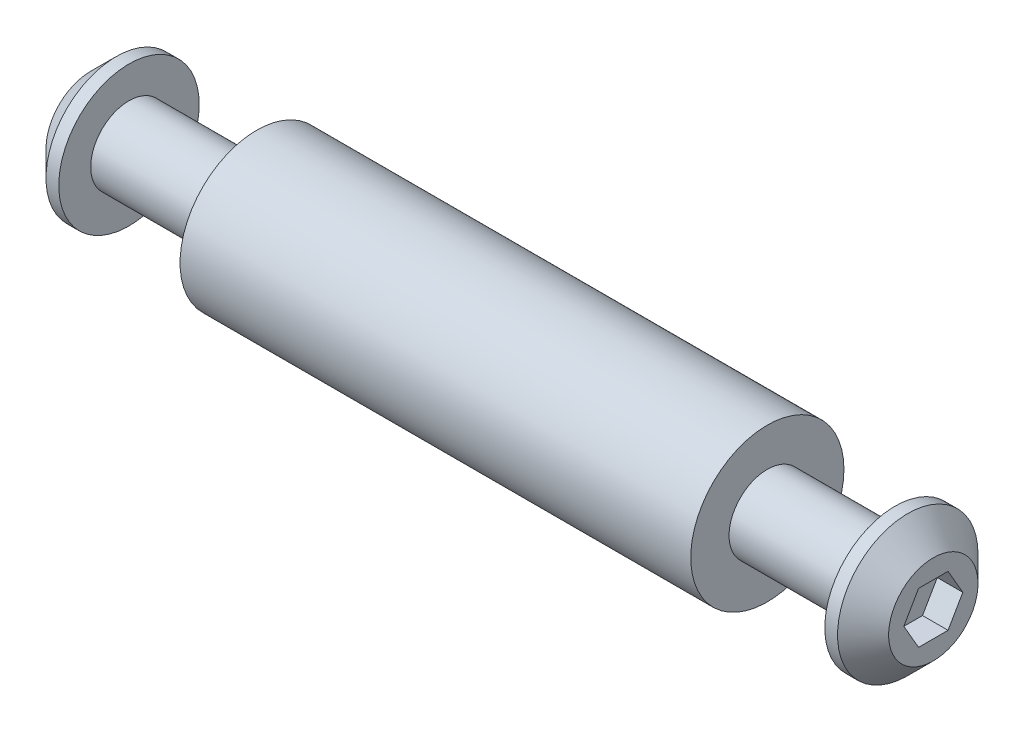
ISO-10303-21;
HEADER;
FILE_DESCRIPTION(('STEP AP214'),'2;1');
FILE_NAME('part.step','',(''),(''),'','','');
FILE_SCHEMA(('AUTOMOTIVE_DESIGN { 1 0 10303 214 1 1 1 1 }'));
ENDSEC;
DATA;
#1=APPLICATION_CONTEXT('core data for automotive mechanical design processes');
#2=APPLICATION_PROTOCOL_DEFINITION('international standard','automotive_design',2000,#1);
#3=PRODUCT_CONTEXT('',#1,'mechanical');
#4=PRODUCT('Part','Part','',(#3));
#5=PRODUCT_RELATED_PRODUCT_CATEGORY('part','',(#4));
#6=PRODUCT_DEFINITION_FORMATION('','',#4);
#7=PRODUCT_DEFINITION_CONTEXT('part definition',#1,'design');
#8=PRODUCT_DEFINITION('design','',#6,#7);
#9=PRODUCT_DEFINITION_SHAPE('','',#8);
#10=(LENGTH_UNIT() NAMED_UNIT(*) SI_UNIT(.MILLI.,.METRE.));
#11=(NAMED_UNIT(*) PLANE_ANGLE_UNIT() SI_UNIT($,.RADIAN.));
#12=(NAMED_UNIT(*) SI_UNIT($,.STERADIAN.) SOLID_ANGLE_UNIT());
#13=UNCERTAINTY_MEASURE_WITH_UNIT(LENGTH_MEASURE(1.E-05),#10,'distance_accuracy_value','');
#14=(GEOMETRIC_REPRESENTATION_CONTEXT(3) GLOBAL_UNCERTAINTY_ASSIGNED_CONTEXT((#13)) GLOBAL_UNIT_ASSIGNED_CONTEXT((#10,
#11,#12)) REPRESENTATION_CONTEXT('',''));
#15=CARTESIAN_POINT('',(0.,0.,0.));
#16=DIRECTION('',(0.,0.,1.));
#17=DIRECTION('',(1.,0.,0.));
#18=AXIS2_PLACEMENT_3D('',#15,#16,#17);
#19=CARTESIAN_POINT('',(-16.5,1.75,0.));
#20=DIRECTION('',(-1.,0.,0.));
#21=DIRECTION('',(0.,0.,1.));
#22=AXIS2_PLACEMENT_3D('',#19,#20,#21);
#23=PLANE('',#22);
#24=CARTESIAN_POINT('',(-16.5,0.,0.));
#25=DIRECTION('',(1.,0.,0.));
#26=DIRECTION('',(0.,0.,-1.));
#27=AXIS2_PLACEMENT_3D('',#24,#25,#26);
#28=CIRCLE('',#27,1.75);
#29=CARTESIAN_POINT('',(-16.5,0.,-1.75));
#30=VERTEX_POINT('',#29);
#31=EDGE_CURVE('E245',#30,#30,#28,.T.);
#32=ORIENTED_EDGE('',*,*,#31,.F.);
#33=EDGE_LOOP('',(#32));
#34=FACE_BOUND('',#33,.T.);
#35=DIRECTION('',(0.,0.866025403784439,-0.5));
#36=VECTOR('',#35,1.);
#37=CARTESIAN_POINT('',(-16.5,-1.,-0.577350269189626));
#38=LINE('',#37,#36);
#39=CARTESIAN_POINT('',(-16.5,-1.,-0.577350269189626));
#40=VERTEX_POINT('',#39);
#41=CARTESIAN_POINT('',(-16.5,0.,-1.15470053837925));
#42=VERTEX_POINT('',#41);
#43=EDGE_CURVE('E156',#40,#42,#38,.T.);
#44=ORIENTED_EDGE('',*,*,#43,.T.);
#45=DIRECTION('',(0.,0.866025403784439,0.5));
#46=VECTOR('',#45,1.);
#47=CARTESIAN_POINT('',(-16.5,0.,-1.15470053837925));
#48=LINE('',#47,#46);
#49=CARTESIAN_POINT('',(-16.5,1.,-0.577350269189626));
#50=VERTEX_POINT('',#49);
#51=EDGE_CURVE('E48',#42,#50,#48,.T.);
#52=ORIENTED_EDGE('',*,*,#51,.T.);
#53=DIRECTION('',(0.,0.,1.));
#54=VECTOR('',#53,1.);
#55=CARTESIAN_POINT('',(-16.5,1.,-0.577350269189626));
#56=LINE('',#55,#54);
#57=CARTESIAN_POINT('',(-16.5,1.,0.577350269189626));
#58=VERTEX_POINT('',#57);
#59=EDGE_CURVE('E143',#50,#58,#56,.T.);
#60=ORIENTED_EDGE('',*,*,#59,.T.);
#61=DIRECTION('',(0.,-0.866025403784438,0.5));
#62=VECTOR('',#61,1.);
#63=CARTESIAN_POINT('',(-16.5,1.,0.577350269189626));
#64=LINE('',#63,#62);
#65=CARTESIAN_POINT('',(-16.5,0.,1.15470053837925));
#66=VERTEX_POINT('',#65);
#67=EDGE_CURVE('E146',#58,#66,#64,.T.);
#68=ORIENTED_EDGE('',*,*,#67,.T.);
#69=DIRECTION('',(0.,-0.866025403784439,-0.5));
#70=VECTOR('',#69,1.);
#71=CARTESIAN_POINT('',(-16.5,0.,1.15470053837925));
#72=LINE('',#71,#70);
#73=CARTESIAN_POINT('',(-16.5,-1.,0.577350269189627));
#74=VERTEX_POINT('',#73);
#75=EDGE_CURVE('E161',#66,#74,#72,.T.);
#76=ORIENTED_EDGE('',*,*,#75,.T.);
#77=DIRECTION('',(0.,0.,-1.));
#78=VECTOR('',#77,1.);
#79=CARTESIAN_POINT('',(-16.5,-1.,0.577350269189627));
#80=LINE('',#79,#78);
#81=EDGE_CURVE('E158',#74,#40,#80,.T.);
#82=ORIENTED_EDGE('',*,*,#81,.T.);
#83=EDGE_LOOP('',(#44,#52,#60,#68,#76,#82));
#84=FACE_BOUND('',#83,.T.);
#85=ADVANCED_FACE('F33',(#34,#84),#23,.T.);
#86=CARTESIAN_POINT('',(15.,1.5,0.));
#87=DIRECTION('',(-1.,0.,0.));
#88=DIRECTION('',(0.,0.,1.));
#89=AXIS2_PLACEMENT_3D('',#86,#87,#88);
#90=PLANE('',#89);
#91=CARTESIAN_POINT('',(15.,0.,0.));
#92=DIRECTION('',(1.,0.,0.));
#93=DIRECTION('',(0.,0.,-1.));
#94=AXIS2_PLACEMENT_3D('',#91,#92,#93);
#95=CIRCLE('',#94,1.5);
#96=CARTESIAN_POINT('',(15.,0.,-1.5));
#97=VERTEX_POINT('',#96);
#98=EDGE_CURVE('E212',#97,#97,#95,.T.);
#99=ORIENTED_EDGE('',*,*,#98,.T.);
#100=EDGE_LOOP('',(#99));
#101=FACE_BOUND('',#100,.T.);
#102=CARTESIAN_POINT('',(15.,0.,0.));
#103=DIRECTION('',(1.,0.,0.));
#104=DIRECTION('',(0.,0.,-1.));
#105=AXIS2_PLACEMENT_3D('',#102,#103,#104);
#106=CIRCLE('',#105,2.75000000000004);
#107=CARTESIAN_POINT('',(15.,0.,-2.75000000000004));
#108=VERTEX_POINT('',#107);
#109=EDGE_CURVE('E11',#108,#108,#106,.T.);
#110=ORIENTED_EDGE('',*,*,#109,.F.);
#111=EDGE_LOOP('',(#110));
#112=FACE_BOUND('',#111,.T.);
#113=ADVANCED_FACE('F35',(#101,#112),#90,.T.);
#114=CARTESIAN_POINT('',(0.,0.,0.));
#115=DIRECTION('',(1.,0.,0.));
#116=DIRECTION('',(0.,0.,-1.));
#117=AXIS2_PLACEMENT_3D('',#114,#115,#116);
#118=CYLINDRICAL_SURFACE('',#117,2.75000000000002);
#119=ORIENTED_EDGE('',*,*,#109,.T.);
#120=EDGE_LOOP('',(#119));
#121=FACE_BOUND('',#120,.T.);
#122=CARTESIAN_POINT('',(15.5,0.,0.));
#123=DIRECTION('',(1.,0.,0.));
#124=DIRECTION('',(0.,0.,-1.));
#125=AXIS2_PLACEMENT_3D('',#122,#123,#124);
#126=CIRCLE('',#125,2.75);
#127=CARTESIAN_POINT('',(15.5,0.,-2.75));
#128=VERTEX_POINT('',#127);
#129=EDGE_CURVE('E41',#128,#128,#126,.T.);
#130=ORIENTED_EDGE('',*,*,#129,.F.);
#131=EDGE_LOOP('',(#130));
#132=FACE_BOUND('',#131,.T.);
#133=ADVANCED_FACE('F256',(#121,#132),#118,.T.);
#134=CARTESIAN_POINT('',(16.5,0.,0.));
#135=DIRECTION('',(-1.,0.,0.));
#136=DIRECTION('',(0.,0.,1.));
#137=AXIS2_PLACEMENT_3D('',#134,#135,#136);
#138=CONICAL_SURFACE('',#137,1.75,0.78539816339745);
#139=ORIENTED_EDGE('',*,*,#129,.T.);
#140=EDGE_LOOP('',(#139));
#141=FACE_BOUND('',#140,.T.);
#142=CARTESIAN_POINT('',(16.5,0.,0.));
#143=DIRECTION('',(1.,0.,0.));
#144=DIRECTION('',(0.,0.,-1.));
#145=AXIS2_PLACEMENT_3D('',#142,#143,#144);
#146=CIRCLE('',#145,1.75);
#147=CARTESIAN_POINT('',(16.5,0.,-1.75));
#148=VERTEX_POINT('',#147);
#149=EDGE_CURVE('E248',#148,#148,#146,.T.);
#150=ORIENTED_EDGE('',*,*,#149,.F.);
#151=EDGE_LOOP('',(#150));
#152=FACE_BOUND('',#151,.T.);
#153=ADVANCED_FACE('F253',(#141,#152),#138,.T.);
#154=CARTESIAN_POINT('',(16.5,1.75,0.));
#155=DIRECTION('',(1.,0.,0.));
#156=DIRECTION('',(0.,0.,-1.));
#157=AXIS2_PLACEMENT_3D('',#154,#155,#156);
#158=PLANE('',#157);
#159=DIRECTION('',(0.,0.866025403784439,0.5));
#160=VECTOR('',#159,1.);
#161=CARTESIAN_POINT('',(16.5,0.,-1.15470053837925));
#162=LINE('',#161,#160);
#163=CARTESIAN_POINT('',(16.5,0.,-1.15470053837925));
#164=VERTEX_POINT('',#163);
#165=CARTESIAN_POINT('',(16.5,1.,-0.577350269189626));
#166=VERTEX_POINT('',#165);
#167=EDGE_CURVE('E56',#164,#166,#162,.T.);
#168=ORIENTED_EDGE('',*,*,#167,.F.);
#169=DIRECTION('',(0.,0.866025403784439,-0.5));
#170=VECTOR('',#169,1.);
#171=CARTESIAN_POINT('',(16.5,-1.,-0.577350269189626));
#172=LINE('',#171,#170);
#173=CARTESIAN_POINT('',(16.5,-1.,-0.577350269189626));
#174=VERTEX_POINT('',#173);
#175=EDGE_CURVE('E179',#174,#164,#172,.T.);
#176=ORIENTED_EDGE('',*,*,#175,.F.);
#177=DIRECTION('',(0.,0.,-1.));
#178=VECTOR('',#177,1.);
#179=CARTESIAN_POINT('',(16.5,-1.,0.577350269189627));
#180=LINE('',#179,#178);
#181=CARTESIAN_POINT('',(16.5,-1.,0.577350269189627));
#182=VERTEX_POINT('',#181);
#183=EDGE_CURVE('E205',#182,#174,#180,.T.);
#184=ORIENTED_EDGE('',*,*,#183,.F.);
#185=DIRECTION('',(0.,-0.866025403784439,-0.5));
#186=VECTOR('',#185,1.);
#187=CARTESIAN_POINT('',(16.5,0.,1.15470053837925));
#188=LINE('',#187,#186);
#189=CARTESIAN_POINT('',(16.5,0.,1.15470053837925));
#190=VERTEX_POINT('',#189);
#191=EDGE_CURVE('E202',#190,#182,#188,.T.);
#192=ORIENTED_EDGE('',*,*,#191,.F.);
#193=DIRECTION('',(0.,-0.866025403784438,0.5));
#194=VECTOR('',#193,1.);
#195=CARTESIAN_POINT('',(16.5,1.,0.577350269189626));
#196=LINE('',#195,#194);
#197=CARTESIAN_POINT('',(16.5,1.,0.577350269189626));
#198=VERTEX_POINT('',#197);
#199=EDGE_CURVE('E199',#198,#190,#196,.T.);
#200=ORIENTED_EDGE('',*,*,#199,.F.);
#201=DIRECTION('',(0.,0.,1.));
#202=VECTOR('',#201,1.);
#203=CARTESIAN_POINT('',(16.5,1.,-0.577350269189626));
#204=LINE('',#203,#202);
#205=EDGE_CURVE('E196',#166,#198,#204,.T.);
#206=ORIENTED_EDGE('',*,*,#205,.F.);
#207=EDGE_LOOP('',(#168,#176,#184,#192,#200,#206));
#208=FACE_BOUND('',#207,.T.);
#209=ORIENTED_EDGE('',*,*,#149,.T.);
#210=EDGE_LOOP('',(#209));
#211=FACE_BOUND('',#210,.T.);
#212=ADVANCED_FACE('F263',(#208,#211),#158,.T.);
#213=CARTESIAN_POINT('',(-15.5,0.,0.));
#214=DIRECTION('',(1.,0.,0.));
#215=DIRECTION('',(0.,0.,-1.));
#216=AXIS2_PLACEMENT_3D('',#213,#214,#215);
#217=CONICAL_SURFACE('',#216,2.75,0.78539816339745);
#218=ORIENTED_EDGE('',*,*,#31,.T.);
#219=EDGE_LOOP('',(#218));
#220=FACE_BOUND('',#219,.T.);
#221=CARTESIAN_POINT('',(-15.5,0.,0.));
#222=DIRECTION('',(1.,0.,0.));
#223=DIRECTION('',(0.,0.,-1.));
#224=AXIS2_PLACEMENT_3D('',#221,#222,#223);
#225=CIRCLE('',#224,2.75);
#226=CARTESIAN_POINT('',(-15.5,0.,-2.75));
#227=VERTEX_POINT('',#226);
#228=EDGE_CURVE('E242',#227,#227,#225,.T.);
#229=ORIENTED_EDGE('',*,*,#228,.F.);
#230=EDGE_LOOP('',(#229));
#231=FACE_BOUND('',#230,.T.);
#232=ADVANCED_FACE('F275',(#220,#231),#217,.T.);
#233=CARTESIAN_POINT('',(0.,0.,0.));
#234=DIRECTION('',(1.,0.,0.));
#235=DIRECTION('',(0.,0.,-1.));
#236=AXIS2_PLACEMENT_3D('',#233,#234,#235);
#237=CYLINDRICAL_SURFACE('',#236,2.75);
#238=ORIENTED_EDGE('',*,*,#228,.T.);
#239=EDGE_LOOP('',(#238));
#240=FACE_BOUND('',#239,.T.);
#241=CARTESIAN_POINT('',(-15.,0.,0.));
#242=DIRECTION('',(1.,0.,0.));
#243=DIRECTION('',(0.,0.,-1.));
#244=AXIS2_PLACEMENT_3D('',#241,#242,#243);
#245=CIRCLE('',#244,2.75);
#246=CARTESIAN_POINT('',(-15.,0.,-2.75));
#247=VERTEX_POINT('',#246);
#248=EDGE_CURVE('E239',#247,#247,#245,.T.);
#249=ORIENTED_EDGE('',*,*,#248,.F.);
#250=EDGE_LOOP('',(#249));
#251=FACE_BOUND('',#250,.T.);
#252=ADVANCED_FACE('F282',(#240,#251),#237,.T.);
#253=CARTESIAN_POINT('',(-15.,1.5,0.));
#254=DIRECTION('',(1.,0.,0.));
#255=DIRECTION('',(0.,0.,-1.));
#256=AXIS2_PLACEMENT_3D('',#253,#254,#255);
#257=PLANE('',#256);
#258=ORIENTED_EDGE('',*,*,#248,.T.);
#259=EDGE_LOOP('',(#258));
#260=FACE_BOUND('',#259,.T.);
#261=CARTESIAN_POINT('',(-15.,0.,0.));
#262=DIRECTION('',(1.,0.,0.));
#263=DIRECTION('',(0.,0.,-1.));
#264=AXIS2_PLACEMENT_3D('',#261,#262,#263);
#265=CIRCLE('',#264,1.5);
#266=CARTESIAN_POINT('',(-15.,0.,-1.5));
#267=VERTEX_POINT('',#266);
#268=EDGE_CURVE('E236',#267,#267,#265,.T.);
#269=ORIENTED_EDGE('',*,*,#268,.F.);
#270=EDGE_LOOP('',(#269));
#271=FACE_BOUND('',#270,.T.);
#272=ADVANCED_FACE('F341',(#260,#271),#257,.T.);
#273=CARTESIAN_POINT('',(0.,0.,0.));
#274=DIRECTION('',(1.,0.,0.));
#275=DIRECTION('',(0.,0.,-1.));
#276=AXIS2_PLACEMENT_3D('',#273,#274,#275);
#277=CYLINDRICAL_SURFACE('',#276,1.5);
#278=ORIENTED_EDGE('',*,*,#268,.T.);
#279=EDGE_LOOP('',(#278));
#280=FACE_BOUND('',#279,.T.);
#281=CARTESIAN_POINT('',(-10.,0.,0.));
#282=DIRECTION('',(1.,0.,0.));
#283=DIRECTION('',(0.,0.,-1.));
#284=AXIS2_PLACEMENT_3D('',#281,#282,#283);
#285=CIRCLE('',#284,1.5);
#286=CARTESIAN_POINT('',(-10.,0.,-1.5));
#287=VERTEX_POINT('',#286);
#288=EDGE_CURVE('E233',#287,#287,#285,.T.);
#289=ORIENTED_EDGE('',*,*,#288,.F.);
#290=EDGE_LOOP('',(#289));
#291=FACE_BOUND('',#290,.T.);
#292=ADVANCED_FACE('F337',(#280,#291),#277,.T.);
#293=CARTESIAN_POINT('',(-10.,3.,0.));
#294=DIRECTION('',(-1.,0.,0.));
#295=DIRECTION('',(0.,0.,1.));
#296=AXIS2_PLACEMENT_3D('',#293,#294,#295);
#297=PLANE('',#296);
#298=ORIENTED_EDGE('',*,*,#288,.T.);
#299=EDGE_LOOP('',(#298));
#300=FACE_BOUND('',#299,.T.);
#301=CARTESIAN_POINT('',(-10.,0.,0.));
#302=DIRECTION('',(1.,0.,0.));
#303=DIRECTION('',(0.,0.,-1.));
#304=AXIS2_PLACEMENT_3D('',#301,#302,#303);
#305=CIRCLE('',#304,3.);
#306=CARTESIAN_POINT('',(-10.,0.,-3.));
#307=VERTEX_POINT('',#306);
#308=EDGE_CURVE('E230',#307,#307,#305,.T.);
#309=ORIENTED_EDGE('',*,*,#308,.F.);
#310=EDGE_LOOP('',(#309));
#311=FACE_BOUND('',#310,.T.);
#312=ADVANCED_FACE('F333',(#300,#311),#297,.T.);
#313=CARTESIAN_POINT('',(0.,0.,0.));
#314=DIRECTION('',(1.,0.,0.));
#315=DIRECTION('',(0.,0.,-1.));
#316=AXIS2_PLACEMENT_3D('',#313,#314,#315);
#317=CYLINDRICAL_SURFACE('',#316,3.);
#318=ORIENTED_EDGE('',*,*,#308,.T.);
#319=EDGE_LOOP('',(#318));
#320=FACE_BOUND('',#319,.T.);
#321=CARTESIAN_POINT('',(10.,0.,0.));
#322=DIRECTION('',(1.,0.,0.));
#323=DIRECTION('',(0.,0.,-1.));
#324=AXIS2_PLACEMENT_3D('',#321,#322,#323);
#325=CIRCLE('',#324,3.);
#326=CARTESIAN_POINT('',(10.,0.,-3.));
#327=VERTEX_POINT('',#326);
#328=EDGE_CURVE('E227',#327,#327,#325,.T.);
#329=ORIENTED_EDGE('',*,*,#328,.F.);
#330=EDGE_LOOP('',(#329));
#331=FACE_BOUND('',#330,.T.);
#332=ADVANCED_FACE('F329',(#320,#331),#317,.T.);
#333=CARTESIAN_POINT('',(10.,3.,0.));
#334=DIRECTION('',(1.,0.,0.));
#335=DIRECTION('',(0.,0.,-1.));
#336=AXIS2_PLACEMENT_3D('',#333,#334,#335);
#337=PLANE('',#336);
#338=ORIENTED_EDGE('',*,*,#328,.T.);
#339=EDGE_LOOP('',(#338));
#340=FACE_BOUND('',#339,.T.);
#341=CARTESIAN_POINT('',(10.,0.,0.));
#342=DIRECTION('',(1.,0.,0.));
#343=DIRECTION('',(0.,0.,-1.));
#344=AXIS2_PLACEMENT_3D('',#341,#342,#343);
#345=CIRCLE('',#344,1.5);
#346=CARTESIAN_POINT('',(10.,0.,-1.5));
#347=VERTEX_POINT('',#346);
#348=EDGE_CURVE('E224',#347,#347,#345,.T.);
#349=ORIENTED_EDGE('',*,*,#348,.F.);
#350=EDGE_LOOP('',(#349));
#351=FACE_BOUND('',#350,.T.);
#352=ADVANCED_FACE('F325',(#340,#351),#337,.T.);
#353=CARTESIAN_POINT('',(0.,0.,0.));
#354=DIRECTION('',(1.,0.,0.));
#355=DIRECTION('',(0.,0.,-1.));
#356=AXIS2_PLACEMENT_3D('',#353,#354,#355);
#357=CYLINDRICAL_SURFACE('',#356,1.5);
#358=ORIENTED_EDGE('',*,*,#348,.T.);
#359=EDGE_LOOP('',(#358));
#360=FACE_BOUND('',#359,.T.);
#361=ORIENTED_EDGE('',*,*,#98,.F.);
#362=EDGE_LOOP('',(#361));
#363=FACE_BOUND('',#362,.T.);
#364=ADVANCED_FACE('F322',(#360,#363),#357,.T.);
#365=CARTESIAN_POINT('',(15.5,0.,-1.15470053837925));
#366=DIRECTION('',(0.,0.5,-0.866025403784439));
#367=DIRECTION('',(0.,0.866025403784439,0.5));
#368=AXIS2_PLACEMENT_3D('',#365,#366,#367);
#369=PLANE('',#368);
#370=ORIENTED_EDGE('',*,*,#167,.T.);
#371=DIRECTION('',(1.,0.,0.));
#372=VECTOR('',#371,1.);
#373=CARTESIAN_POINT('',(15.5,1.,-0.577350269189626));
#374=LINE('',#373,#372);
#375=CARTESIAN_POINT('',(15.5,1.,-0.577350269189626));
#376=VERTEX_POINT('',#375);
#377=EDGE_CURVE('E194',#376,#166,#374,.T.);
#378=ORIENTED_EDGE('',*,*,#377,.F.);
#379=DIRECTION('',(0.,0.866025403784439,0.5));
#380=VECTOR('',#379,1.);
#381=CARTESIAN_POINT('',(15.5,0.,-1.15470053837925));
#382=LINE('',#381,#380);
#383=CARTESIAN_POINT('',(15.5,0.,-1.15470053837925));
#384=VERTEX_POINT('',#383);
#385=EDGE_CURVE('E175',#384,#376,#382,.T.);
#386=ORIENTED_EDGE('',*,*,#385,.F.);
#387=DIRECTION('',(1.,0.,0.));
#388=VECTOR('',#387,1.);
#389=CARTESIAN_POINT('',(15.5,0.,-1.15470053837925));
#390=LINE('',#389,#388);
#391=EDGE_CURVE('E210',#384,#164,#390,.T.);
#392=ORIENTED_EDGE('',*,*,#391,.T.);
#393=EDGE_LOOP('',(#370,#378,#386,#392));
#394=FACE_BOUND('',#393,.T.);
#395=ADVANCED_FACE('F296',(#394),#369,.F.);
#396=CARTESIAN_POINT('',(15.5,-1.,-0.577350269189626));
#397=DIRECTION('',(0.,-0.5,-0.866025403784439));
#398=DIRECTION('',(0.,0.866025403784439,-0.5));
#399=AXIS2_PLACEMENT_3D('',#396,#397,#398);
#400=PLANE('',#399);
#401=ORIENTED_EDGE('',*,*,#175,.T.);
#402=ORIENTED_EDGE('',*,*,#391,.F.);
#403=DIRECTION('',(0.,0.866025403784439,-0.5));
#404=VECTOR('',#403,1.);
#405=CARTESIAN_POINT('',(15.5,-1.,-0.577350269189626));
#406=LINE('',#405,#404);
#407=CARTESIAN_POINT('',(15.5,-1.,-0.577350269189626));
#408=VERTEX_POINT('',#407);
#409=EDGE_CURVE('E191',#408,#384,#406,.T.);
#410=ORIENTED_EDGE('',*,*,#409,.F.);
#411=DIRECTION('',(1.,0.,0.));
#412=VECTOR('',#411,1.);
#413=CARTESIAN_POINT('',(15.5,-1.,-0.577350269189626));
#414=LINE('',#413,#412);
#415=EDGE_CURVE('E213',#408,#174,#414,.T.);
#416=ORIENTED_EDGE('',*,*,#415,.T.);
#417=EDGE_LOOP('',(#401,#402,#410,#416));
#418=FACE_BOUND('',#417,.T.);
#419=ADVANCED_FACE('F302',(#418),#400,.F.);
#420=CARTESIAN_POINT('',(15.5,-1.,0.577350269189627));
#421=DIRECTION('',(0.,-1.,0.));
#422=DIRECTION('',(0.,0.,-1.));
#423=AXIS2_PLACEMENT_3D('',#420,#421,#422);
#424=PLANE('',#423);
#425=ORIENTED_EDGE('',*,*,#183,.T.);
#426=ORIENTED_EDGE('',*,*,#415,.F.);
#427=DIRECTION('',(0.,0.,-1.));
#428=VECTOR('',#427,1.);
#429=CARTESIAN_POINT('',(15.5,-1.,0.577350269189627));
#430=LINE('',#429,#428);
#431=CARTESIAN_POINT('',(15.5,-1.,0.577350269189627));
#432=VERTEX_POINT('',#431);
#433=EDGE_CURVE('E188',#432,#408,#430,.T.);
#434=ORIENTED_EDGE('',*,*,#433,.F.);
#435=DIRECTION('',(1.,0.,0.));
#436=VECTOR('',#435,1.);
#437=CARTESIAN_POINT('',(15.5,-1.,0.577350269189627));
#438=LINE('',#437,#436);
#439=EDGE_CURVE('E215',#432,#182,#438,.T.);
#440=ORIENTED_EDGE('',*,*,#439,.T.);
#441=EDGE_LOOP('',(#425,#426,#434,#440));
#442=FACE_BOUND('',#441,.T.);
#443=ADVANCED_FACE('F304',(#442),#424,.F.);
#444=CARTESIAN_POINT('',(15.5,0.,1.15470053837925));
#445=DIRECTION('',(0.,-0.5,0.866025403784439));
#446=DIRECTION('',(0.,-0.866025403784439,-0.5));
#447=AXIS2_PLACEMENT_3D('',#444,#445,#446);
#448=PLANE('',#447);
#449=ORIENTED_EDGE('',*,*,#191,.T.);
#450=ORIENTED_EDGE('',*,*,#439,.F.);
#451=DIRECTION('',(0.,-0.866025403784439,-0.5));
#452=VECTOR('',#451,1.);
#453=CARTESIAN_POINT('',(15.5,0.,1.15470053837925));
#454=LINE('',#453,#452);
#455=CARTESIAN_POINT('',(15.5,0.,1.15470053837925));
#456=VERTEX_POINT('',#455);
#457=EDGE_CURVE('E185',#456,#432,#454,.T.);
#458=ORIENTED_EDGE('',*,*,#457,.F.);
#459=DIRECTION('',(1.,0.,0.));
#460=VECTOR('',#459,1.);
#461=CARTESIAN_POINT('',(15.5,0.,1.15470053837925));
#462=LINE('',#461,#460);
#463=EDGE_CURVE('E217',#456,#190,#462,.T.);
#464=ORIENTED_EDGE('',*,*,#463,.T.);
#465=EDGE_LOOP('',(#449,#450,#458,#464));
#466=FACE_BOUND('',#465,.T.);
#467=ADVANCED_FACE('F306',(#466),#448,.F.);
#468=CARTESIAN_POINT('',(15.5,1.,0.577350269189626));
#469=DIRECTION('',(0.,0.5,0.866025403784438));
#470=DIRECTION('',(0.,-0.866025403784439,0.5));
#471=AXIS2_PLACEMENT_3D('',#468,#469,#470);
#472=PLANE('',#471);
#473=ORIENTED_EDGE('',*,*,#199,.T.);
#474=ORIENTED_EDGE('',*,*,#463,.F.);
#475=DIRECTION('',(0.,-0.866025403784438,0.5));
#476=VECTOR('',#475,1.);
#477=CARTESIAN_POINT('',(15.5,1.,0.577350269189626));
#478=LINE('',#477,#476);
#479=CARTESIAN_POINT('',(15.5,1.,0.577350269189626));
#480=VERTEX_POINT('',#479);
#481=EDGE_CURVE('E182',#480,#456,#478,.T.);
#482=ORIENTED_EDGE('',*,*,#481,.F.);
#483=DIRECTION('',(1.,0.,0.));
#484=VECTOR('',#483,1.);
#485=CARTESIAN_POINT('',(15.5,1.,0.577350269189626));
#486=LINE('',#485,#484);
#487=EDGE_CURVE('E219',#480,#198,#486,.T.);
#488=ORIENTED_EDGE('',*,*,#487,.T.);
#489=EDGE_LOOP('',(#473,#474,#482,#488));
#490=FACE_BOUND('',#489,.T.);
#491=ADVANCED_FACE('F309',(#490),#472,.F.);
#492=CARTESIAN_POINT('',(15.5,1.,-0.577350269189626));
#493=DIRECTION('',(0.,1.,0.));
#494=DIRECTION('',(0.,0.,1.));
#495=AXIS2_PLACEMENT_3D('',#492,#493,#494);
#496=PLANE('',#495);
#497=ORIENTED_EDGE('',*,*,#205,.T.);
#498=ORIENTED_EDGE('',*,*,#487,.F.);
#499=DIRECTION('',(0.,0.,1.));
#500=VECTOR('',#499,1.);
#501=CARTESIAN_POINT('',(15.5,1.,-0.577350269189626));
#502=LINE('',#501,#500);
#503=EDGE_CURVE('E178',#376,#480,#502,.T.);
#504=ORIENTED_EDGE('',*,*,#503,.F.);
#505=ORIENTED_EDGE('',*,*,#377,.T.);
#506=EDGE_LOOP('',(#497,#498,#504,#505));
#507=FACE_BOUND('',#506,.T.);
#508=ADVANCED_FACE('F292',(#507),#496,.F.);
#509=CARTESIAN_POINT('',(15.5,0.,0.));
#510=DIRECTION('',(1.,0.,0.));
#511=DIRECTION('',(0.,0.,-1.));
#512=AXIS2_PLACEMENT_3D('',#509,#510,#511);
#513=PLANE('',#512);
#514=ORIENTED_EDGE('',*,*,#385,.T.);
#515=ORIENTED_EDGE('',*,*,#503,.T.);
#516=ORIENTED_EDGE('',*,*,#481,.T.);
#517=ORIENTED_EDGE('',*,*,#457,.T.);
#518=ORIENTED_EDGE('',*,*,#433,.T.);
#519=ORIENTED_EDGE('',*,*,#409,.T.);
#520=EDGE_LOOP('',(#514,#515,#516,#517,#518,#519));
#521=FACE_BOUND('',#520,.T.);
#522=ADVANCED_FACE('F299',(#521),#513,.T.);
#523=CARTESIAN_POINT('',(-15.5,0.,-1.15470053837925));
#524=DIRECTION('',(0.,-0.5,0.866025403784439));
#525=DIRECTION('',(0.,-0.866025403784439,-0.5));
#526=AXIS2_PLACEMENT_3D('',#523,#524,#525);
#527=PLANE('',#526);
#528=ORIENTED_EDGE('',*,*,#51,.F.);
#529=DIRECTION('',(-1.,0.,0.));
#530=VECTOR('',#529,1.);
#531=CARTESIAN_POINT('',(-15.5,0.,-1.15470053837925));
#532=LINE('',#531,#530);
#533=CARTESIAN_POINT('',(-15.5,0.,-1.15470053837925));
#534=VERTEX_POINT('',#533);
#535=EDGE_CURVE('E127',#534,#42,#532,.T.);
#536=ORIENTED_EDGE('',*,*,#535,.F.);
#537=DIRECTION('',(0.,0.866025403784439,0.5));
#538=VECTOR('',#537,1.);
#539=CARTESIAN_POINT('',(-15.5,0.,-1.15470053837925));
#540=LINE('',#539,#538);
#541=CARTESIAN_POINT('',(-15.5,1.,-0.577350269189626));
#542=VERTEX_POINT('',#541);
#543=EDGE_CURVE('E134',#534,#542,#540,.T.);
#544=ORIENTED_EDGE('',*,*,#543,.T.);
#545=DIRECTION('',(-1.,0.,0.));
#546=VECTOR('',#545,1.);
#547=CARTESIAN_POINT('',(-15.5,1.,-0.577350269189626));
#548=LINE('',#547,#546);
#549=EDGE_CURVE('E166',#542,#50,#548,.T.);
#550=ORIENTED_EDGE('',*,*,#549,.T.);
#551=EDGE_LOOP('',(#528,#536,#544,#550));
#552=FACE_BOUND('',#551,.T.);
#553=ADVANCED_FACE('F137',(#552),#527,.T.);
#554=CARTESIAN_POINT('',(-15.5,1.,-0.577350269189626));
#555=DIRECTION('',(0.,-1.,0.));
#556=DIRECTION('',(0.,0.,-1.));
#557=AXIS2_PLACEMENT_3D('',#554,#555,#556);
#558=PLANE('',#557);
#559=ORIENTED_EDGE('',*,*,#59,.F.);
#560=ORIENTED_EDGE('',*,*,#549,.F.);
#561=DIRECTION('',(0.,0.,1.));
#562=VECTOR('',#561,1.);
#563=CARTESIAN_POINT('',(-15.5,1.,-0.577350269189626));
#564=LINE('',#563,#562);
#565=CARTESIAN_POINT('',(-15.5,1.,0.577350269189626));
#566=VERTEX_POINT('',#565);
#567=EDGE_CURVE('E139',#542,#566,#564,.T.);
#568=ORIENTED_EDGE('',*,*,#567,.T.);
#569=DIRECTION('',(-1.,0.,0.));
#570=VECTOR('',#569,1.);
#571=CARTESIAN_POINT('',(-15.5,1.,0.577350269189626));
#572=LINE('',#571,#570);
#573=EDGE_CURVE('E168',#566,#58,#572,.T.);
#574=ORIENTED_EDGE('',*,*,#573,.T.);
#575=EDGE_LOOP('',(#559,#560,#568,#574));
#576=FACE_BOUND('',#575,.T.);
#577=ADVANCED_FACE('F443',(#576),#558,.T.);
#578=CARTESIAN_POINT('',(-15.5,1.,0.577350269189626));
#579=DIRECTION('',(0.,-0.5,-0.866025403784438));
#580=DIRECTION('',(0.,0.866025403784439,-0.5));
#581=AXIS2_PLACEMENT_3D('',#578,#579,#580);
#582=PLANE('',#581);
#583=ORIENTED_EDGE('',*,*,#67,.F.);
#584=ORIENTED_EDGE('',*,*,#573,.F.);
#585=DIRECTION('',(0.,-0.866025403784438,0.5));
#586=VECTOR('',#585,1.);
#587=CARTESIAN_POINT('',(-15.5,1.,0.577350269189626));
#588=LINE('',#587,#586);
#589=CARTESIAN_POINT('',(-15.5,0.,1.15470053837925));
#590=VERTEX_POINT('',#589);
#591=EDGE_CURVE('E152',#566,#590,#588,.T.);
#592=ORIENTED_EDGE('',*,*,#591,.T.);
#593=DIRECTION('',(-1.,0.,0.));
#594=VECTOR('',#593,1.);
#595=CARTESIAN_POINT('',(-15.5,0.,1.15470053837925));
#596=LINE('',#595,#594);
#597=EDGE_CURVE('E170',#590,#66,#596,.T.);
#598=ORIENTED_EDGE('',*,*,#597,.T.);
#599=EDGE_LOOP('',(#583,#584,#592,#598));
#600=FACE_BOUND('',#599,.T.);
#601=ADVANCED_FACE('F452',(#600),#582,.T.);
#602=CARTESIAN_POINT('',(-15.5,0.,1.15470053837925));
#603=DIRECTION('',(0.,0.5,-0.866025403784439));
#604=DIRECTION('',(0.,0.866025403784439,0.5));
#605=AXIS2_PLACEMENT_3D('',#602,#603,#604);
#606=PLANE('',#605);
#607=ORIENTED_EDGE('',*,*,#75,.F.);
#608=ORIENTED_EDGE('',*,*,#597,.F.);
#609=DIRECTION('',(0.,-0.866025403784439,-0.5));
#610=VECTOR('',#609,1.);
#611=CARTESIAN_POINT('',(-15.5,0.,1.15470053837925));
#612=LINE('',#611,#610);
#613=CARTESIAN_POINT('',(-15.5,-1.,0.577350269189627));
#614=VERTEX_POINT('',#613);
#615=EDGE_CURVE('E150',#590,#614,#612,.T.);
#616=ORIENTED_EDGE('',*,*,#615,.T.);
#617=DIRECTION('',(-1.,0.,0.));
#618=VECTOR('',#617,1.);
#619=CARTESIAN_POINT('',(-15.5,-1.,0.577350269189627));
#620=LINE('',#619,#618);
#621=EDGE_CURVE('E172',#614,#74,#620,.T.);
#622=ORIENTED_EDGE('',*,*,#621,.T.);
#623=EDGE_LOOP('',(#607,#608,#616,#622));
#624=FACE_BOUND('',#623,.T.);
#625=ADVANCED_FACE('F462',(#624),#606,.T.);
#626=CARTESIAN_POINT('',(-15.5,-1.,0.577350269189627));
#627=DIRECTION('',(0.,1.,0.));
#628=DIRECTION('',(0.,0.,1.));
#629=AXIS2_PLACEMENT_3D('',#626,#627,#628);
#630=PLANE('',#629);
#631=ORIENTED_EDGE('',*,*,#81,.F.);
#632=ORIENTED_EDGE('',*,*,#621,.F.);
#633=DIRECTION('',(0.,0.,-1.));
#634=VECTOR('',#633,1.);
#635=CARTESIAN_POINT('',(-15.5,-1.,0.577350269189627));
#636=LINE('',#635,#634);
#637=CARTESIAN_POINT('',(-15.5,-1.,-0.577350269189626));
#638=VERTEX_POINT('',#637);
#639=EDGE_CURVE('E133',#614,#638,#636,.T.);
#640=ORIENTED_EDGE('',*,*,#639,.T.);
#641=DIRECTION('',(-1.,0.,0.));
#642=VECTOR('',#641,1.);
#643=CARTESIAN_POINT('',(-15.5,-1.,-0.577350269189626));
#644=LINE('',#643,#642);
#645=EDGE_CURVE('E129',#638,#40,#644,.T.);
#646=ORIENTED_EDGE('',*,*,#645,.T.);
#647=EDGE_LOOP('',(#631,#632,#640,#646));
#648=FACE_BOUND('',#647,.T.);
#649=ADVANCED_FACE('F472',(#648),#630,.T.);
#650=CARTESIAN_POINT('',(-15.5,-1.,-0.577350269189626));
#651=DIRECTION('',(0.,0.5,0.866025403784439));
#652=DIRECTION('',(0.,-0.866025403784439,0.5));
#653=AXIS2_PLACEMENT_3D('',#650,#651,#652);
#654=PLANE('',#653);
#655=ORIENTED_EDGE('',*,*,#43,.F.);
#656=ORIENTED_EDGE('',*,*,#645,.F.);
#657=DIRECTION('',(0.,0.866025403784439,-0.5));
#658=VECTOR('',#657,1.);
#659=CARTESIAN_POINT('',(-15.5,-1.,-0.577350269189626));
#660=LINE('',#659,#658);
#661=EDGE_CURVE('E124',#638,#534,#660,.T.);
#662=ORIENTED_EDGE('',*,*,#661,.T.);
#663=ORIENTED_EDGE('',*,*,#535,.T.);
#664=EDGE_LOOP('',(#655,#656,#662,#663));
#665=FACE_BOUND('',#664,.T.);
#666=ADVANCED_FACE('F126',(#665),#654,.T.);
#667=CARTESIAN_POINT('',(-15.5,0.,0.));
#668=DIRECTION('',(-1.,0.,0.));
#669=DIRECTION('',(0.,0.,-1.));
#670=AXIS2_PLACEMENT_3D('',#667,#668,#669);
#671=PLANE('',#670);
#672=ORIENTED_EDGE('',*,*,#543,.F.);
#673=ORIENTED_EDGE('',*,*,#661,.F.);
#674=ORIENTED_EDGE('',*,*,#639,.F.);
#675=ORIENTED_EDGE('',*,*,#615,.F.);
#676=ORIENTED_EDGE('',*,*,#591,.F.);
#677=ORIENTED_EDGE('',*,*,#567,.F.);
#678=EDGE_LOOP('',(#672,#673,#674,#675,#676,#677));
#679=FACE_BOUND('',#678,.T.);
#680=ADVANCED_FACE('F141',(#679),#671,.T.);
#681=CLOSED_SHELL('',(#85,#113,#133,#153,#212,#232,#252,#272,#292,#312,#332,#352,#364,#395,#419,
#443,#467,#491,#508,#522,#553,#577,#601,#625,#649,#666,#680));
#682=MANIFOLD_SOLID_BREP('B2',#681);
#683=ADVANCED_BREP_SHAPE_REPRESENTATION('',(#18,#682),#14);
#684=SHAPE_DEFINITION_REPRESENTATION(#9,#683);
ENDSEC;
END-ISO-10303-21;
